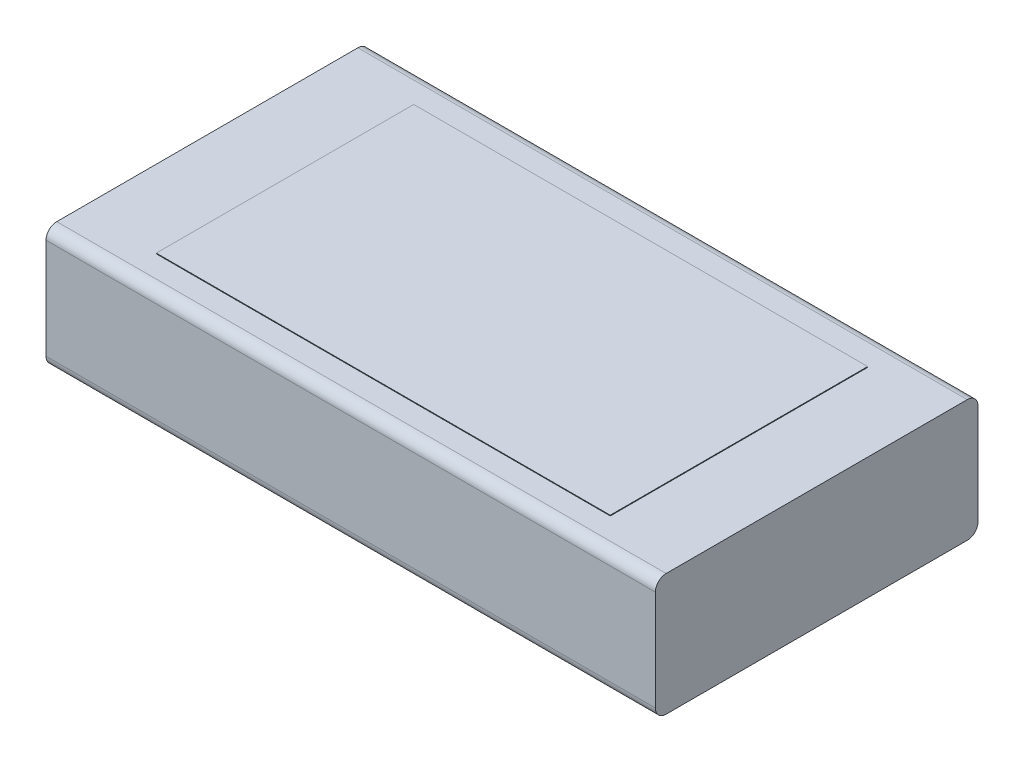
ISO-10303-21;
HEADER;
FILE_DESCRIPTION(('STEP AP214'),'2;1');
FILE_NAME('part.step','',(''),(''),'','','');
FILE_SCHEMA(('AUTOMOTIVE_DESIGN { 1 0 10303 214 1 1 1 1 }'));
ENDSEC;
DATA;
#1=APPLICATION_CONTEXT('core data for automotive mechanical design processes');
#2=APPLICATION_PROTOCOL_DEFINITION('international standard','automotive_design',2000,#1);
#3=PRODUCT_CONTEXT('',#1,'mechanical');
#4=PRODUCT('Part','Part','',(#3));
#5=PRODUCT_RELATED_PRODUCT_CATEGORY('part','',(#4));
#6=PRODUCT_DEFINITION_FORMATION('','',#4);
#7=PRODUCT_DEFINITION_CONTEXT('part definition',#1,'design');
#8=PRODUCT_DEFINITION('design','',#6,#7);
#9=PRODUCT_DEFINITION_SHAPE('','',#8);
#10=(LENGTH_UNIT() NAMED_UNIT(*) SI_UNIT(.MILLI.,.METRE.));
#11=(NAMED_UNIT(*) PLANE_ANGLE_UNIT() SI_UNIT($,.RADIAN.));
#12=(NAMED_UNIT(*) SI_UNIT($,.STERADIAN.) SOLID_ANGLE_UNIT());
#13=UNCERTAINTY_MEASURE_WITH_UNIT(LENGTH_MEASURE(1.E-05),#10,'distance_accuracy_value','');
#14=(GEOMETRIC_REPRESENTATION_CONTEXT(3) GLOBAL_UNCERTAINTY_ASSIGNED_CONTEXT((#13)) GLOBAL_UNIT_ASSIGNED_CONTEXT((#10,
#11,#12)) REPRESENTATION_CONTEXT('',''));
#15=CARTESIAN_POINT('',(0.,0.,0.));
#16=DIRECTION('',(0.,0.,1.));
#17=DIRECTION('',(1.,0.,0.));
#18=AXIS2_PLACEMENT_3D('',#15,#16,#17);
#19=CARTESIAN_POINT('',(0.,17.,0.));
#20=DIRECTION('',(0.,1.,0.));
#21=DIRECTION('',(0.,0.,1.));
#22=AXIS2_PLACEMENT_3D('',#19,#20,#21);
#23=PLANE('',#22);
#24=DIRECTION('',(0.,0.,-1.));
#25=VECTOR('',#24,1.);
#26=CARTESIAN_POINT('',(42.5,17.,-22.5));
#27=LINE('',#26,#25);
#28=CARTESIAN_POINT('',(42.5,17.,21.));
#29=VERTEX_POINT('',#28);
#30=CARTESIAN_POINT('',(42.5,17.,-21.));
#31=VERTEX_POINT('',#30);
#32=EDGE_CURVE('E159',#29,#31,#27,.T.);
#33=ORIENTED_EDGE('',*,*,#32,.T.);
#34=DIRECTION('',(-1.,0.,0.));
#35=VECTOR('',#34,1.);
#36=CARTESIAN_POINT('',(-42.5,17.,-21.));
#37=LINE('',#36,#35);
#38=CARTESIAN_POINT('',(-42.5,17.,-21.));
#39=VERTEX_POINT('',#38);
#40=EDGE_CURVE('E206',#31,#39,#37,.T.);
#41=ORIENTED_EDGE('',*,*,#40,.T.);
#42=DIRECTION('',(0.,0.,1.));
#43=VECTOR('',#42,1.);
#44=CARTESIAN_POINT('',(-42.5,17.,-22.5));
#45=LINE('',#44,#43);
#46=CARTESIAN_POINT('',(-42.5,17.,21.));
#47=VERTEX_POINT('',#46);
#48=EDGE_CURVE('E162',#39,#47,#45,.T.);
#49=ORIENTED_EDGE('',*,*,#48,.T.);
#50=DIRECTION('',(1.,0.,0.));
#51=VECTOR('',#50,1.);
#52=CARTESIAN_POINT('',(42.5,17.,21.));
#53=LINE('',#52,#51);
#54=EDGE_CURVE('E203',#47,#29,#53,.T.);
#55=ORIENTED_EDGE('',*,*,#54,.T.);
#56=EDGE_LOOP('',(#33,#41,#49,#55));
#57=FACE_BOUND('',#56,.T.);
#58=DIRECTION('',(1.,0.,0.));
#59=VECTOR('',#58,1.);
#60=CARTESIAN_POINT('',(31.6578013167384,17.,17.9522897710773));
#61=LINE('',#60,#59);
#62=CARTESIAN_POINT('',(-31.6578013167384,17.,17.9522897710773));
#63=VERTEX_POINT('',#62);
#64=CARTESIAN_POINT('',(31.6578013167384,17.,17.9522897710773));
#65=VERTEX_POINT('',#64);
#66=EDGE_CURVE('E343',#63,#65,#61,.T.);
#67=ORIENTED_EDGE('',*,*,#66,.F.);
#68=DIRECTION('',(0.,0.,1.));
#69=VECTOR('',#68,1.);
#70=CARTESIAN_POINT('',(-31.6578013167384,17.,17.9522897710773));
#71=LINE('',#70,#69);
#72=CARTESIAN_POINT('',(-31.6578013167384,17.,-17.9522897710773));
#73=VERTEX_POINT('',#72);
#74=EDGE_CURVE('E149',#73,#63,#71,.T.);
#75=ORIENTED_EDGE('',*,*,#74,.F.);
#76=DIRECTION('',(-1.,0.,0.));
#77=VECTOR('',#76,1.);
#78=CARTESIAN_POINT('',(31.6578013167384,17.,-17.9522897710773));
#79=LINE('',#78,#77);
#80=CARTESIAN_POINT('',(31.6578013167384,17.,-17.9522897710773));
#81=VERTEX_POINT('',#80);
#82=EDGE_CURVE('E145',#81,#73,#79,.T.);
#83=ORIENTED_EDGE('',*,*,#82,.F.);
#84=DIRECTION('',(0.,0.,-1.));
#85=VECTOR('',#84,1.);
#86=CARTESIAN_POINT('',(31.6578013167384,17.,17.9522897710773));
#87=LINE('',#86,#85);
#88=EDGE_CURVE('E340',#65,#81,#87,.T.);
#89=ORIENTED_EDGE('',*,*,#88,.F.);
#90=EDGE_LOOP('',(#67,#75,#83,#89));
#91=FACE_BOUND('',#90,.T.);
#92=ADVANCED_FACE('F37',(#57,#91),#23,.T.);
#93=CARTESIAN_POINT('',(42.5,17.,-22.5));
#94=DIRECTION('',(-1.,0.,0.));
#95=DIRECTION('',(0.,0.,1.));
#96=AXIS2_PLACEMENT_3D('',#93,#94,#95);
#97=PLANE('',#96);
#98=DIRECTION('',(0.,0.,-1.));
#99=VECTOR('',#98,1.);
#100=CARTESIAN_POINT('',(42.5,0.,-22.5));
#101=LINE('',#100,#99);
#102=CARTESIAN_POINT('',(42.5,0.,21.));
#103=VERTEX_POINT('',#102);
#104=CARTESIAN_POINT('',(42.5,0.,-21.));
#105=VERTEX_POINT('',#104);
#106=EDGE_CURVE('E151',#103,#105,#101,.T.);
#107=ORIENTED_EDGE('',*,*,#106,.T.);
#108=CARTESIAN_POINT('',(42.5,1.5,-21.));
#109=DIRECTION('',(-1.,0.,0.));
#110=DIRECTION('',(0.,0.,1.));
#111=AXIS2_PLACEMENT_3D('',#108,#109,#110);
#112=CIRCLE('',#111,1.5);
#113=CARTESIAN_POINT('',(42.5,1.5,-22.5));
#114=VERTEX_POINT('',#113);
#115=EDGE_CURVE('E201',#105,#114,#112,.F.);
#116=ORIENTED_EDGE('',*,*,#115,.T.);
#117=DIRECTION('',(0.,-1.,0.));
#118=VECTOR('',#117,1.);
#119=CARTESIAN_POINT('',(42.5,17.,-22.5));
#120=LINE('',#119,#118);
#121=CARTESIAN_POINT('',(42.5,15.5,-22.5));
#122=VERTEX_POINT('',#121);
#123=EDGE_CURVE('E176',#122,#114,#120,.T.);
#124=ORIENTED_EDGE('',*,*,#123,.F.);
#125=CARTESIAN_POINT('',(42.5,15.5,-21.));
#126=DIRECTION('',(-1.,0.,0.));
#127=DIRECTION('',(0.,0.,1.));
#128=AXIS2_PLACEMENT_3D('',#125,#126,#127);
#129=CIRCLE('',#128,1.5);
#130=EDGE_CURVE('E199',#122,#31,#129,.F.);
#131=ORIENTED_EDGE('',*,*,#130,.T.);
#132=ORIENTED_EDGE('',*,*,#32,.F.);
#133=CARTESIAN_POINT('',(42.5,15.5,21.));
#134=DIRECTION('',(-1.,0.,0.));
#135=DIRECTION('',(0.,0.,1.));
#136=AXIS2_PLACEMENT_3D('',#133,#134,#135);
#137=CIRCLE('',#136,1.5);
#138=CARTESIAN_POINT('',(42.5,15.5,22.5));
#139=VERTEX_POINT('',#138);
#140=EDGE_CURVE('E196',#29,#139,#137,.F.);
#141=ORIENTED_EDGE('',*,*,#140,.T.);
#142=DIRECTION('',(0.,-1.,0.));
#143=VECTOR('',#142,1.);
#144=CARTESIAN_POINT('',(42.5,17.,22.5));
#145=LINE('',#144,#143);
#146=CARTESIAN_POINT('',(42.5,1.5,22.5));
#147=VERTEX_POINT('',#146);
#148=EDGE_CURVE('E164',#139,#147,#145,.T.);
#149=ORIENTED_EDGE('',*,*,#148,.T.);
#150=CARTESIAN_POINT('',(42.5,1.5,21.));
#151=DIRECTION('',(-1.,0.,0.));
#152=DIRECTION('',(0.,0.,1.));
#153=AXIS2_PLACEMENT_3D('',#150,#151,#152);
#154=CIRCLE('',#153,1.5);
#155=EDGE_CURVE('E60',#147,#103,#154,.F.);
#156=ORIENTED_EDGE('',*,*,#155,.T.);
#157=EDGE_LOOP('',(#107,#116,#124,#131,#132,#141,#149,#156));
#158=FACE_BOUND('',#157,.T.);
#159=ADVANCED_FACE('F225',(#158),#97,.F.);
#160=CARTESIAN_POINT('',(-42.5,17.,-22.5));
#161=DIRECTION('',(0.,0.,1.));
#162=DIRECTION('',(1.,0.,0.));
#163=AXIS2_PLACEMENT_3D('',#160,#161,#162);
#164=PLANE('',#163);
#165=ORIENTED_EDGE('',*,*,#123,.T.);
#166=DIRECTION('',(-1.,0.,0.));
#167=VECTOR('',#166,1.);
#168=CARTESIAN_POINT('',(-42.5,1.5,-22.5));
#169=LINE('',#168,#167);
#170=CARTESIAN_POINT('',(-42.5,1.5,-22.5));
#171=VERTEX_POINT('',#170);
#172=EDGE_CURVE('E181',#114,#171,#169,.T.);
#173=ORIENTED_EDGE('',*,*,#172,.T.);
#174=DIRECTION('',(0.,-1.,0.));
#175=VECTOR('',#174,1.);
#176=CARTESIAN_POINT('',(-42.5,17.,-22.5));
#177=LINE('',#176,#175);
#178=CARTESIAN_POINT('',(-42.5,15.5,-22.5));
#179=VERTEX_POINT('',#178);
#180=EDGE_CURVE('E173',#179,#171,#177,.T.);
#181=ORIENTED_EDGE('',*,*,#180,.F.);
#182=DIRECTION('',(-1.,0.,0.));
#183=VECTOR('',#182,1.);
#184=CARTESIAN_POINT('',(42.5,15.5,-22.5));
#185=LINE('',#184,#183);
#186=EDGE_CURVE('E179',#179,#122,#185,.F.);
#187=ORIENTED_EDGE('',*,*,#186,.T.);
#188=EDGE_LOOP('',(#165,#173,#181,#187));
#189=FACE_BOUND('',#188,.T.);
#190=ADVANCED_FACE('F233',(#189),#164,.F.);
#191=CARTESIAN_POINT('',(-42.5,17.,-22.5));
#192=DIRECTION('',(1.,0.,0.));
#193=DIRECTION('',(0.,0.,-1.));
#194=AXIS2_PLACEMENT_3D('',#191,#192,#193);
#195=PLANE('',#194);
#196=ORIENTED_EDGE('',*,*,#180,.T.);
#197=CARTESIAN_POINT('',(-42.5,1.5,-21.));
#198=DIRECTION('',(1.,0.,0.));
#199=DIRECTION('',(0.,0.,-1.));
#200=AXIS2_PLACEMENT_3D('',#197,#198,#199);
#201=CIRCLE('',#200,1.5);
#202=CARTESIAN_POINT('',(-42.5,0.,-21.));
#203=VERTEX_POINT('',#202);
#204=EDGE_CURVE('E190',#171,#203,#201,.F.);
#205=ORIENTED_EDGE('',*,*,#204,.T.);
#206=DIRECTION('',(0.,0.,1.));
#207=VECTOR('',#206,1.);
#208=CARTESIAN_POINT('',(-42.5,0.,-22.5));
#209=LINE('',#208,#207);
#210=CARTESIAN_POINT('',(-42.5,0.,21.));
#211=VERTEX_POINT('',#210);
#212=EDGE_CURVE('E154',#203,#211,#209,.T.);
#213=ORIENTED_EDGE('',*,*,#212,.T.);
#214=CARTESIAN_POINT('',(-42.5,1.5,21.));
#215=DIRECTION('',(1.,0.,0.));
#216=DIRECTION('',(0.,0.,-1.));
#217=AXIS2_PLACEMENT_3D('',#214,#215,#216);
#218=CIRCLE('',#217,1.5);
#219=CARTESIAN_POINT('',(-42.5,1.5,22.5));
#220=VERTEX_POINT('',#219);
#221=EDGE_CURVE('E186',#211,#220,#218,.F.);
#222=ORIENTED_EDGE('',*,*,#221,.T.);
#223=DIRECTION('',(0.,-1.,0.));
#224=VECTOR('',#223,1.);
#225=CARTESIAN_POINT('',(-42.5,17.,22.5));
#226=LINE('',#225,#224);
#227=CARTESIAN_POINT('',(-42.5,15.5,22.5));
#228=VERTEX_POINT('',#227);
#229=EDGE_CURVE('E170',#228,#220,#226,.T.);
#230=ORIENTED_EDGE('',*,*,#229,.F.);
#231=CARTESIAN_POINT('',(-42.5,15.5,21.));
#232=DIRECTION('',(1.,0.,0.));
#233=DIRECTION('',(0.,0.,-1.));
#234=AXIS2_PLACEMENT_3D('',#231,#232,#233);
#235=CIRCLE('',#234,1.5);
#236=EDGE_CURVE('E184',#228,#47,#235,.F.);
#237=ORIENTED_EDGE('',*,*,#236,.T.);
#238=ORIENTED_EDGE('',*,*,#48,.F.);
#239=CARTESIAN_POINT('',(-42.5,15.5,-21.));
#240=DIRECTION('',(1.,0.,0.));
#241=DIRECTION('',(0.,0.,-1.));
#242=AXIS2_PLACEMENT_3D('',#239,#240,#241);
#243=CIRCLE('',#242,1.5);
#244=EDGE_CURVE('E188',#39,#179,#243,.F.);
#245=ORIENTED_EDGE('',*,*,#244,.T.);
#246=EDGE_LOOP('',(#196,#205,#213,#222,#230,#237,#238,#245));
#247=FACE_BOUND('',#246,.T.);
#248=ADVANCED_FACE('F216',(#247),#195,.F.);
#249=CARTESIAN_POINT('',(-42.5,17.,22.5));
#250=DIRECTION('',(0.,0.,-1.));
#251=DIRECTION('',(-1.,0.,0.));
#252=AXIS2_PLACEMENT_3D('',#249,#250,#251);
#253=PLANE('',#252);
#254=ORIENTED_EDGE('',*,*,#229,.T.);
#255=DIRECTION('',(1.,0.,0.));
#256=VECTOR('',#255,1.);
#257=CARTESIAN_POINT('',(-42.5,1.5,22.5));
#258=LINE('',#257,#256);
#259=EDGE_CURVE('E11',#220,#147,#258,.T.);
#260=ORIENTED_EDGE('',*,*,#259,.T.);
#261=ORIENTED_EDGE('',*,*,#148,.F.);
#262=DIRECTION('',(1.,0.,0.));
#263=VECTOR('',#262,1.);
#264=CARTESIAN_POINT('',(-42.5,15.5,22.5));
#265=LINE('',#264,#263);
#266=EDGE_CURVE('E45',#139,#228,#265,.F.);
#267=ORIENTED_EDGE('',*,*,#266,.T.);
#268=EDGE_LOOP('',(#254,#260,#261,#267));
#269=FACE_BOUND('',#268,.T.);
#270=ADVANCED_FACE('F212',(#269),#253,.F.);
#271=CARTESIAN_POINT('',(0.,0.,0.));
#272=DIRECTION('',(0.,1.,0.));
#273=DIRECTION('',(0.,0.,1.));
#274=AXIS2_PLACEMENT_3D('',#271,#272,#273);
#275=PLANE('',#274);
#276=ORIENTED_EDGE('',*,*,#212,.F.);
#277=DIRECTION('',(-1.,0.,0.));
#278=VECTOR('',#277,1.);
#279=CARTESIAN_POINT('',(0.,0.,-21.));
#280=LINE('',#279,#278);
#281=EDGE_CURVE('E194',#203,#105,#280,.F.);
#282=ORIENTED_EDGE('',*,*,#281,.T.);
#283=ORIENTED_EDGE('',*,*,#106,.F.);
#284=DIRECTION('',(1.,0.,0.));
#285=VECTOR('',#284,1.);
#286=CARTESIAN_POINT('',(0.,0.,21.));
#287=LINE('',#286,#285);
#288=EDGE_CURVE('E192',#103,#211,#287,.F.);
#289=ORIENTED_EDGE('',*,*,#288,.T.);
#290=EDGE_LOOP('',(#276,#282,#283,#289));
#291=FACE_BOUND('',#290,.T.);
#292=ADVANCED_FACE('F241',(#291),#275,.F.);
#293=CARTESIAN_POINT('',(-42.5,1.5,-21.));
#294=DIRECTION('',(-1.,0.,0.));
#295=DIRECTION('',(0.,0.,1.));
#296=AXIS2_PLACEMENT_3D('',#293,#294,#295);
#297=CYLINDRICAL_SURFACE('',#296,1.5);
#298=ORIENTED_EDGE('',*,*,#115,.F.);
#299=ORIENTED_EDGE('',*,*,#281,.F.);
#300=ORIENTED_EDGE('',*,*,#204,.F.);
#301=ORIENTED_EDGE('',*,*,#172,.F.);
#302=EDGE_LOOP('',(#298,#299,#300,#301));
#303=FACE_BOUND('',#302,.T.);
#304=ADVANCED_FACE('F237',(#303),#297,.T.);
#305=CARTESIAN_POINT('',(0.,15.5,-21.));
#306=DIRECTION('',(1.,0.,0.));
#307=DIRECTION('',(0.,0.,-1.));
#308=AXIS2_PLACEMENT_3D('',#305,#306,#307);
#309=CYLINDRICAL_SURFACE('',#308,1.5);
#310=ORIENTED_EDGE('',*,*,#130,.F.);
#311=ORIENTED_EDGE('',*,*,#186,.F.);
#312=ORIENTED_EDGE('',*,*,#244,.F.);
#313=ORIENTED_EDGE('',*,*,#40,.F.);
#314=EDGE_LOOP('',(#310,#311,#312,#313));
#315=FACE_BOUND('',#314,.T.);
#316=ADVANCED_FACE('F230',(#315),#309,.T.);
#317=CARTESIAN_POINT('',(-42.5,1.5,21.));
#318=DIRECTION('',(1.,0.,0.));
#319=DIRECTION('',(0.,0.,-1.));
#320=AXIS2_PLACEMENT_3D('',#317,#318,#319);
#321=CYLINDRICAL_SURFACE('',#320,1.5);
#322=ORIENTED_EDGE('',*,*,#221,.F.);
#323=ORIENTED_EDGE('',*,*,#288,.F.);
#324=ORIENTED_EDGE('',*,*,#155,.F.);
#325=ORIENTED_EDGE('',*,*,#259,.F.);
#326=EDGE_LOOP('',(#322,#323,#324,#325));
#327=FACE_BOUND('',#326,.T.);
#328=ADVANCED_FACE('F243',(#327),#321,.T.);
#329=CARTESIAN_POINT('',(0.,15.5,21.));
#330=DIRECTION('',(-1.,0.,0.));
#331=DIRECTION('',(0.,0.,1.));
#332=AXIS2_PLACEMENT_3D('',#329,#330,#331);
#333=CYLINDRICAL_SURFACE('',#332,1.5);
#334=ORIENTED_EDGE('',*,*,#236,.F.);
#335=ORIENTED_EDGE('',*,*,#266,.F.);
#336=ORIENTED_EDGE('',*,*,#140,.F.);
#337=ORIENTED_EDGE('',*,*,#54,.F.);
#338=EDGE_LOOP('',(#334,#335,#336,#337));
#339=FACE_BOUND('',#338,.T.);
#340=ADVANCED_FACE('F39',(#339),#333,.T.);
#341=CARTESIAN_POINT('',(-31.6578013167384,17.1,17.9522897710773));
#342=DIRECTION('',(1.,0.,0.));
#343=DIRECTION('',(0.,0.,-1.));
#344=AXIS2_PLACEMENT_3D('',#341,#342,#343);
#345=PLANE('',#344);
#346=ORIENTED_EDGE('',*,*,#74,.T.);
#347=DIRECTION('',(0.,-1.,0.));
#348=VECTOR('',#347,1.);
#349=CARTESIAN_POINT('',(-31.6578013167384,17.1,17.9522897710773));
#350=LINE('',#349,#348);
#351=CARTESIAN_POINT('',(-31.6578013167384,17.1,17.9522897710773));
#352=VERTEX_POINT('',#351);
#353=EDGE_CURVE('E130',#352,#63,#350,.T.);
#354=ORIENTED_EDGE('',*,*,#353,.F.);
#355=DIRECTION('',(0.,0.,1.));
#356=VECTOR('',#355,1.);
#357=CARTESIAN_POINT('',(-31.6578013167384,17.1,17.9522897710773));
#358=LINE('',#357,#356);
#359=CARTESIAN_POINT('',(-31.6578013167384,17.1,-17.9522897710773));
#360=VERTEX_POINT('',#359);
#361=EDGE_CURVE('E137',#360,#352,#358,.T.);
#362=ORIENTED_EDGE('',*,*,#361,.F.);
#363=DIRECTION('',(0.,-1.,0.));
#364=VECTOR('',#363,1.);
#365=CARTESIAN_POINT('',(-31.6578013167384,17.1,-17.9522897710773));
#366=LINE('',#365,#364);
#367=EDGE_CURVE('E338',#360,#73,#366,.T.);
#368=ORIENTED_EDGE('',*,*,#367,.T.);
#369=EDGE_LOOP('',(#346,#354,#362,#368));
#370=FACE_BOUND('',#369,.T.);
#371=ADVANCED_FACE('F147',(#370),#345,.F.);
#372=CARTESIAN_POINT('',(31.6578013167384,17.1,17.9522897710773));
#373=DIRECTION('',(0.,0.,-1.));
#374=DIRECTION('',(-1.,0.,0.));
#375=AXIS2_PLACEMENT_3D('',#372,#373,#374);
#376=PLANE('',#375);
#377=ORIENTED_EDGE('',*,*,#66,.T.);
#378=DIRECTION('',(0.,-1.,0.));
#379=VECTOR('',#378,1.);
#380=CARTESIAN_POINT('',(31.6578013167384,17.1,17.9522897710773));
#381=LINE('',#380,#379);
#382=CARTESIAN_POINT('',(31.6578013167384,17.1,17.9522897710773));
#383=VERTEX_POINT('',#382);
#384=EDGE_CURVE('E133',#383,#65,#381,.T.);
#385=ORIENTED_EDGE('',*,*,#384,.F.);
#386=DIRECTION('',(1.,0.,0.));
#387=VECTOR('',#386,1.);
#388=CARTESIAN_POINT('',(31.6578013167384,17.1,17.9522897710773));
#389=LINE('',#388,#387);
#390=EDGE_CURVE('E126',#352,#383,#389,.T.);
#391=ORIENTED_EDGE('',*,*,#390,.F.);
#392=ORIENTED_EDGE('',*,*,#353,.T.);
#393=EDGE_LOOP('',(#377,#385,#391,#392));
#394=FACE_BOUND('',#393,.T.);
#395=ADVANCED_FACE('F128',(#394),#376,.F.);
#396=CARTESIAN_POINT('',(31.6578013167384,17.1,17.9522897710773));
#397=DIRECTION('',(-1.,0.,0.));
#398=DIRECTION('',(0.,0.,1.));
#399=AXIS2_PLACEMENT_3D('',#396,#397,#398);
#400=PLANE('',#399);
#401=ORIENTED_EDGE('',*,*,#88,.T.);
#402=DIRECTION('',(0.,-1.,0.));
#403=VECTOR('',#402,1.);
#404=CARTESIAN_POINT('',(31.6578013167384,17.1,-17.9522897710773));
#405=LINE('',#404,#403);
#406=CARTESIAN_POINT('',(31.6578013167384,17.1,-17.9522897710773));
#407=VERTEX_POINT('',#406);
#408=EDGE_CURVE('E52',#407,#81,#405,.T.);
#409=ORIENTED_EDGE('',*,*,#408,.F.);
#410=DIRECTION('',(0.,0.,-1.));
#411=VECTOR('',#410,1.);
#412=CARTESIAN_POINT('',(31.6578013167384,17.1,17.9522897710773));
#413=LINE('',#412,#411);
#414=EDGE_CURVE('E136',#383,#407,#413,.T.);
#415=ORIENTED_EDGE('',*,*,#414,.F.);
#416=ORIENTED_EDGE('',*,*,#384,.T.);
#417=EDGE_LOOP('',(#401,#409,#415,#416));
#418=FACE_BOUND('',#417,.T.);
#419=ADVANCED_FACE('F303',(#418),#400,.F.);
#420=CARTESIAN_POINT('',(31.6578013167384,17.1,-17.9522897710773));
#421=DIRECTION('',(0.,0.,1.));
#422=DIRECTION('',(1.,0.,0.));
#423=AXIS2_PLACEMENT_3D('',#420,#421,#422);
#424=PLANE('',#423);
#425=ORIENTED_EDGE('',*,*,#82,.T.);
#426=ORIENTED_EDGE('',*,*,#367,.F.);
#427=DIRECTION('',(-1.,0.,0.));
#428=VECTOR('',#427,1.);
#429=CARTESIAN_POINT('',(31.6578013167384,17.1,-17.9522897710773));
#430=LINE('',#429,#428);
#431=EDGE_CURVE('E141',#407,#360,#430,.T.);
#432=ORIENTED_EDGE('',*,*,#431,.F.);
#433=ORIENTED_EDGE('',*,*,#408,.T.);
#434=EDGE_LOOP('',(#425,#426,#432,#433));
#435=FACE_BOUND('',#434,.T.);
#436=ADVANCED_FACE('F309',(#435),#424,.F.);
#437=CARTESIAN_POINT('',(0.,17.1,0.));
#438=DIRECTION('',(0.,1.,0.));
#439=DIRECTION('',(0.,0.,1.));
#440=AXIS2_PLACEMENT_3D('',#437,#438,#439);
#441=PLANE('',#440);
#442=ORIENTED_EDGE('',*,*,#361,.T.);
#443=ORIENTED_EDGE('',*,*,#390,.T.);
#444=ORIENTED_EDGE('',*,*,#414,.T.);
#445=ORIENTED_EDGE('',*,*,#431,.T.);
#446=EDGE_LOOP('',(#442,#443,#444,#445));
#447=FACE_BOUND('',#446,.T.);
#448=ADVANCED_FACE('F140',(#447),#441,.T.);
#449=CLOSED_SHELL('',(#92,#159,#190,#248,#270,#292,#304,#316,#328,#340,#371,#395,#419,#436,#448));
#450=MANIFOLD_SOLID_BREP('B2',#449);
#451=ADVANCED_BREP_SHAPE_REPRESENTATION('',(#18,#450),#14);
#452=SHAPE_DEFINITION_REPRESENTATION(#9,#451);
ENDSEC;
END-ISO-10303-21;
